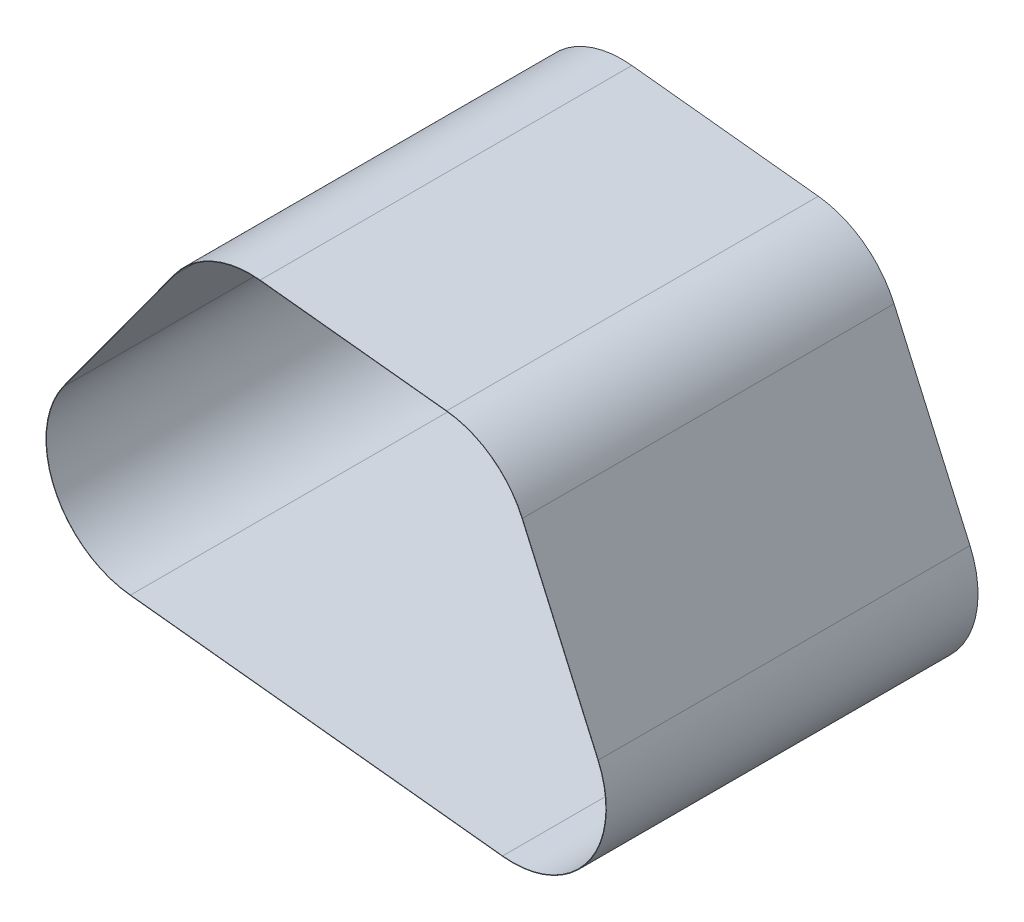
ISO-10303-21;
HEADER;
FILE_DESCRIPTION(('STEP AP214'),'2;1');
FILE_NAME('part.step','',(''),(''),'','','');
FILE_SCHEMA(('AUTOMOTIVE_DESIGN { 1 0 10303 214 1 1 1 1 }'));
ENDSEC;
DATA;
#1=APPLICATION_CONTEXT('core data for automotive mechanical design processes');
#2=APPLICATION_PROTOCOL_DEFINITION('international standard','automotive_design',2000,#1);
#3=PRODUCT_CONTEXT('',#1,'mechanical');
#4=PRODUCT('Part','Part','',(#3));
#5=PRODUCT_RELATED_PRODUCT_CATEGORY('part','',(#4));
#6=PRODUCT_DEFINITION_FORMATION('','',#4);
#7=PRODUCT_DEFINITION_CONTEXT('part definition',#1,'design');
#8=PRODUCT_DEFINITION('design','',#6,#7);
#9=PRODUCT_DEFINITION_SHAPE('','',#8);
#10=(LENGTH_UNIT() NAMED_UNIT(*) SI_UNIT(.MILLI.,.METRE.));
#11=(NAMED_UNIT(*) PLANE_ANGLE_UNIT() SI_UNIT($,.RADIAN.));
#12=(NAMED_UNIT(*) SI_UNIT($,.STERADIAN.) SOLID_ANGLE_UNIT());
#13=UNCERTAINTY_MEASURE_WITH_UNIT(LENGTH_MEASURE(1.E-05),#10,'distance_accuracy_value','');
#14=(GEOMETRIC_REPRESENTATION_CONTEXT(3) GLOBAL_UNCERTAINTY_ASSIGNED_CONTEXT((#13)) GLOBAL_UNIT_ASSIGNED_CONTEXT((#10,
#11,#12)) REPRESENTATION_CONTEXT('',''));
#15=CARTESIAN_POINT('',(0.,0.,0.));
#16=DIRECTION('',(0.,0.,1.));
#17=DIRECTION('',(1.,0.,0.));
#18=AXIS2_PLACEMENT_3D('',#15,#16,#17);
#19=CARTESIAN_POINT('',(-41.5867695911767,-37.9134735963859,-44.6));
#20=DIRECTION('',(-0.807848715200213,0.589389899259705,0.));
#21=DIRECTION('',(-0.589389899259705,-0.807848715200213,0.));
#22=AXIS2_PLACEMENT_3D('',#19,#20,#21);
#23=PLANE('',#22);
#24=DIRECTION('',(-0.589389899259705,-0.807848715200213,0.));
#25=VECTOR('',#24,1.);
#26=CARTESIAN_POINT('',(-41.5867695911767,-37.9134735963859,0.));
#27=LINE('',#26,#25);
#28=CARTESIAN_POINT('',(-9.08829804600239,6.63063636667168,0.));
#29=VERTEX_POINT('',#28);
#30=CARTESIAN_POINT('',(-22.3893322446336,-11.6004588755351,0.));
#31=VERTEX_POINT('',#30);
#32=EDGE_CURVE('E298',#29,#31,#27,.T.);
#33=ORIENTED_EDGE('',*,*,#32,.F.);
#34=DIRECTION('',(0.,0.,1.));
#35=VECTOR('',#34,1.);
#36=CARTESIAN_POINT('',(-9.08829804600239,6.63063636667168,-44.6));
#37=LINE('',#36,#35);
#38=CARTESIAN_POINT('',(-9.08829804600239,6.63063636667168,-44.6));
#39=VERTEX_POINT('',#38);
#40=EDGE_CURVE('E12',#39,#29,#37,.T.);
#41=ORIENTED_EDGE('',*,*,#40,.F.);
#42=DIRECTION('',(-0.589389899259705,-0.807848715200213,0.));
#43=VECTOR('',#42,1.);
#44=CARTESIAN_POINT('',(-41.5867695911767,-37.9134735963859,-44.6));
#45=LINE('',#44,#43);
#46=CARTESIAN_POINT('',(-22.3893322446336,-11.6004588755351,-44.6));
#47=VERTEX_POINT('',#46);
#48=EDGE_CURVE('E332',#39,#47,#45,.T.);
#49=ORIENTED_EDGE('',*,*,#48,.T.);
#50=DIRECTION('',(0.,0.,1.));
#51=VECTOR('',#50,1.);
#52=CARTESIAN_POINT('',(-22.3893322446336,-11.6004588755351,-44.6));
#53=LINE('',#52,#51);
#54=EDGE_CURVE('E132',#47,#31,#53,.T.);
#55=ORIENTED_EDGE('',*,*,#54,.T.);
#56=EDGE_LOOP('',(#33,#41,#49,#55));
#57=FACE_BOUND('',#56,.T.);
#58=ADVANCED_FACE('F129',(#57),#23,.T.);
#59=CARTESIAN_POINT('',(0.,0.,-44.6));
#60=DIRECTION('',(0.,0.,1.));
#61=DIRECTION('',(1.,0.,0.));
#62=AXIS2_PLACEMENT_3D('',#59,#60,#61);
#63=CYLINDRICAL_SURFACE('',#62,11.25);
#64=CARTESIAN_POINT('',(0.,0.,0.));
#65=DIRECTION('',(0.,0.,1.));
#66=DIRECTION('',(1.,0.,0.));
#67=AXIS2_PLACEMENT_3D('',#64,#65,#66);
#68=CIRCLE('',#67,11.25);
#69=CARTESIAN_POINT('',(1.19825107569064,11.1860043965487,0.));
#70=VERTEX_POINT('',#69);
#71=EDGE_CURVE('E329',#70,#29,#68,.T.);
#72=ORIENTED_EDGE('',*,*,#71,.F.);
#73=DIRECTION('',(0.,0.,1.));
#74=VECTOR('',#73,1.);
#75=CARTESIAN_POINT('',(1.19825107569064,11.1860043965487,-44.6));
#76=LINE('',#75,#74);
#77=CARTESIAN_POINT('',(1.19825107569064,11.1860043965487,-44.6));
#78=VERTEX_POINT('',#77);
#79=EDGE_CURVE('E137',#78,#70,#76,.T.);
#80=ORIENTED_EDGE('',*,*,#79,.F.);
#81=CARTESIAN_POINT('',(0.,0.,-44.6));
#82=DIRECTION('',(0.,0.,1.));
#83=DIRECTION('',(1.,0.,0.));
#84=AXIS2_PLACEMENT_3D('',#81,#82,#83);
#85=CIRCLE('',#84,11.25);
#86=EDGE_CURVE('E351',#78,#39,#85,.T.);
#87=ORIENTED_EDGE('',*,*,#86,.T.);
#88=ORIENTED_EDGE('',*,*,#40,.T.);
#89=EDGE_LOOP('',(#72,#80,#87,#88));
#90=FACE_BOUND('',#89,.T.);
#91=ADVANCED_FACE('F374',(#90),#63,.T.);
#92=CARTESIAN_POINT('',(18.7766325041362,9.30299830171522,-44.6));
#93=DIRECTION('',(-0.106511206728057,-0.994311501915438,0.));
#94=DIRECTION('',(0.994311501915438,-0.106511206728057,0.));
#95=AXIS2_PLACEMENT_3D('',#92,#93,#94);
#96=PLANE('',#95);
#97=DIRECTION('',(0.994311501915438,-0.106511206728057,0.));
#98=VECTOR('',#97,1.);
#99=CARTESIAN_POINT('',(18.7766325041362,9.30299830171522,0.));
#100=LINE('',#99,#98);
#101=CARTESIAN_POINT('',(23.570259868788,8.78950224516742,0.));
#102=VERTEX_POINT('',#101);
#103=EDGE_CURVE('E326',#70,#102,#100,.T.);
#104=ORIENTED_EDGE('',*,*,#103,.T.);
#105=DIRECTION('',(0.,0.,1.));
#106=VECTOR('',#105,1.);
#107=CARTESIAN_POINT('',(23.570259868788,8.78950224516742,-44.6));
#108=LINE('',#107,#106);
#109=CARTESIAN_POINT('',(23.570259868788,8.78950224516742,-44.6));
#110=VERTEX_POINT('',#109);
#111=EDGE_CURVE('E355',#110,#102,#108,.T.);
#112=ORIENTED_EDGE('',*,*,#111,.F.);
#113=DIRECTION('',(0.994311501915438,-0.106511206728057,0.));
#114=VECTOR('',#113,1.);
#115=CARTESIAN_POINT('',(18.7766325041362,9.30299830171522,-44.6));
#116=LINE('',#115,#114);
#117=EDGE_CURVE('E349',#78,#110,#116,.T.);
#118=ORIENTED_EDGE('',*,*,#117,.F.);
#119=ORIENTED_EDGE('',*,*,#79,.T.);
#120=EDGE_LOOP('',(#104,#112,#118,#119));
#121=FACE_BOUND('',#120,.T.);
#122=ADVANCED_FACE('F397',(#121),#96,.F.);
#123=CARTESIAN_POINT('',(22.3720087930974,-2.39650215138128,-44.6));
#124=DIRECTION('',(0.,0.,1.));
#125=DIRECTION('',(1.,0.,0.));
#126=AXIS2_PLACEMENT_3D('',#123,#124,#125);
#127=CYLINDRICAL_SURFACE('',#126,11.25);
#128=CARTESIAN_POINT('',(22.3720087930974,-2.39650215138128,0.));
#129=DIRECTION('',(0.,0.,1.));
#130=DIRECTION('',(1.,0.,0.));
#131=AXIS2_PLACEMENT_3D('',#128,#129,#130);
#132=CIRCLE('',#131,11.25);
#133=CARTESIAN_POINT('',(32.6584983051983,2.15878417523292,0.));
#134=VERTEX_POINT('',#133);
#135=EDGE_CURVE('E323',#134,#102,#132,.T.);
#136=ORIENTED_EDGE('',*,*,#135,.F.);
#137=DIRECTION('',(0.,0.,1.));
#138=VECTOR('',#137,1.);
#139=CARTESIAN_POINT('',(32.6584983051983,2.15878417523292,-44.6));
#140=LINE('',#139,#138);
#141=CARTESIAN_POINT('',(32.6584983051983,2.15878417523292,-44.6));
#142=VERTEX_POINT('',#141);
#143=EDGE_CURVE('E357',#142,#134,#140,.T.);
#144=ORIENTED_EDGE('',*,*,#143,.F.);
#145=CARTESIAN_POINT('',(22.3720087930974,-2.39650215138128,-44.6));
#146=DIRECTION('',(0.,0.,1.));
#147=DIRECTION('',(1.,0.,0.));
#148=AXIS2_PLACEMENT_3D('',#145,#146,#147);
#149=CIRCLE('',#148,11.25);
#150=EDGE_CURVE('E346',#142,#110,#149,.T.);
#151=ORIENTED_EDGE('',*,*,#150,.T.);
#152=ORIENTED_EDGE('',*,*,#111,.T.);
#153=EDGE_LOOP('',(#136,#144,#151,#152));
#154=FACE_BOUND('',#153,.T.);
#155=ADVANCED_FACE('F394',(#154),#127,.T.);
#156=CARTESIAN_POINT('',(57.5881231878783,-54.1358823966706,-44.6));
#157=DIRECTION('',(-0.914354623297857,-0.404914340143485,0.));
#158=DIRECTION('',(0.404914340143485,-0.914354623297857,0.));
#159=AXIS2_PLACEMENT_3D('',#156,#157,#158);
#160=PLANE('',#159);
#161=DIRECTION('',(0.404914340143485,-0.914354623297857,0.));
#162=VECTOR('',#161,1.);
#163=CARTESIAN_POINT('',(57.5881231878783,-54.1358823966706,0.));
#164=LINE('',#163,#162);
#165=CARTESIAN_POINT('',(41.7690709584267,-18.4141948489689,0.));
#166=VERTEX_POINT('',#165);
#167=EDGE_CURVE('E320',#134,#166,#164,.T.);
#168=ORIENTED_EDGE('',*,*,#167,.T.);
#169=DIRECTION('',(0.,0.,1.));
#170=VECTOR('',#169,1.);
#171=CARTESIAN_POINT('',(41.7690709584267,-18.4141948489689,-44.6));
#172=LINE('',#171,#170);
#173=CARTESIAN_POINT('',(41.7690709584267,-18.4141948489689,-44.6));
#174=VERTEX_POINT('',#173);
#175=EDGE_CURVE('E359',#174,#166,#172,.T.);
#176=ORIENTED_EDGE('',*,*,#175,.F.);
#177=DIRECTION('',(0.404914340143485,-0.914354623297857,0.));
#178=VECTOR('',#177,1.);
#179=CARTESIAN_POINT('',(57.5881231878783,-54.1358823966706,-44.6));
#180=LINE('',#179,#178);
#181=EDGE_CURVE('E344',#142,#174,#180,.T.);
#182=ORIENTED_EDGE('',*,*,#181,.F.);
#183=ORIENTED_EDGE('',*,*,#143,.T.);
#184=EDGE_LOOP('',(#168,#176,#182,#183));
#185=FACE_BOUND('',#184,.T.);
#186=ADVANCED_FACE('F391',(#185),#160,.F.);
#187=CARTESIAN_POINT('',(31.4825814463258,-22.9694811755831,-44.6));
#188=DIRECTION('',(0.,0.,1.));
#189=DIRECTION('',(1.,0.,0.));
#190=AXIS2_PLACEMENT_3D('',#187,#188,#189);
#191=CYLINDRICAL_SURFACE('',#190,11.25);
#192=CARTESIAN_POINT('',(31.4825814463258,-22.9694811755831,0.));
#193=DIRECTION('',(0.,0.,1.));
#194=DIRECTION('',(1.,0.,0.));
#195=AXIS2_PLACEMENT_3D('',#192,#193,#194);
#196=CIRCLE('',#195,11.25);
#197=CARTESIAN_POINT('',(30.284236401296,-34.1554755056841,0.));
#198=VERTEX_POINT('',#197);
#199=EDGE_CURVE('E317',#198,#166,#196,.T.);
#200=ORIENTED_EDGE('',*,*,#199,.F.);
#201=DIRECTION('',(0.,0.,1.));
#202=VECTOR('',#201,1.);
#203=CARTESIAN_POINT('',(30.284236401296,-34.1554755056841,-44.6));
#204=LINE('',#203,#202);
#205=CARTESIAN_POINT('',(30.284236401296,-34.1554755056841,-44.6));
#206=VERTEX_POINT('',#205);
#207=EDGE_CURVE('E361',#206,#198,#204,.T.);
#208=ORIENTED_EDGE('',*,*,#207,.F.);
#209=CARTESIAN_POINT('',(31.4825814463258,-22.9694811755831,-44.6));
#210=DIRECTION('',(0.,0.,1.));
#211=DIRECTION('',(1.,0.,0.));
#212=AXIS2_PLACEMENT_3D('',#209,#210,#211);
#213=CIRCLE('',#212,11.25);
#214=EDGE_CURVE('E341',#206,#174,#213,.T.);
#215=ORIENTED_EDGE('',*,*,#214,.T.);
#216=ORIENTED_EDGE('',*,*,#175,.T.);
#217=EDGE_LOOP('',(#200,#208,#215,#216));
#218=FACE_BOUND('',#217,.T.);
#219=ADVANCED_FACE('F387',(#218),#191,.T.);
#220=CARTESIAN_POINT('',(14.3050733317243,-32.4436428046237,-44.6));
#221=DIRECTION('',(-0.106519559558202,-0.994310607120092,0.));
#222=DIRECTION('',(0.994310607120092,-0.106519559558202,0.));
#223=AXIS2_PLACEMENT_3D('',#220,#221,#222);
#224=PLANE('',#223);
#225=DIRECTION('',(0.994310607120092,-0.106519559558202,0.));
#226=VECTOR('',#225,1.);
#227=CARTESIAN_POINT('',(14.3050733317243,-32.4436428046237,0.));
#228=LINE('',#227,#226);
#229=CARTESIAN_POINT('',(-14.3680404328542,-29.3719191123547,0.));
#230=VERTEX_POINT('',#229);
#231=EDGE_CURVE('E314',#230,#198,#228,.T.);
#232=ORIENTED_EDGE('',*,*,#231,.F.);
#233=DIRECTION('',(0.,0.,1.));
#234=VECTOR('',#233,1.);
#235=CARTESIAN_POINT('',(-14.3680404328542,-29.3719191123547,-44.6));
#236=LINE('',#235,#234);
#237=CARTESIAN_POINT('',(-14.3680404328542,-29.3719191123547,-44.6));
#238=VERTEX_POINT('',#237);
#239=EDGE_CURVE('E362',#238,#230,#236,.T.);
#240=ORIENTED_EDGE('',*,*,#239,.F.);
#241=DIRECTION('',(0.994310607120092,-0.106519559558202,0.));
#242=VECTOR('',#241,1.);
#243=CARTESIAN_POINT('',(14.3050733317243,-32.4436428046237,-44.6));
#244=LINE('',#243,#242);
#245=EDGE_CURVE('E338',#238,#206,#244,.T.);
#246=ORIENTED_EDGE('',*,*,#245,.T.);
#247=ORIENTED_EDGE('',*,*,#207,.T.);
#248=EDGE_LOOP('',(#232,#240,#246,#247));
#249=FACE_BOUND('',#248,.T.);
#250=ADVANCED_FACE('F382',(#249),#224,.T.);
#251=CARTESIAN_POINT('',(-13.2614361398689,-18.1764768728205,-44.6));
#252=DIRECTION('',(0.,0.,1.));
#253=DIRECTION('',(1.,0.,0.));
#254=AXIS2_PLACEMENT_3D('',#251,#252,#253);
#255=CYLINDRICAL_SURFACE('',#254,11.25);
#256=CARTESIAN_POINT('',(-13.2614361398689,-18.1764768728205,0.));
#257=DIRECTION('',(0.,0.,1.));
#258=DIRECTION('',(1.,0.,0.));
#259=AXIS2_PLACEMENT_3D('',#256,#257,#258);
#260=CIRCLE('',#259,11.25);
#261=EDGE_CURVE('E311',#31,#230,#260,.T.);
#262=ORIENTED_EDGE('',*,*,#261,.F.);
#263=ORIENTED_EDGE('',*,*,#54,.F.);
#264=CARTESIAN_POINT('',(-13.2614361398689,-18.1764768728205,-44.6));
#265=DIRECTION('',(0.,0.,1.));
#266=DIRECTION('',(1.,0.,0.));
#267=AXIS2_PLACEMENT_3D('',#264,#265,#266);
#268=CIRCLE('',#267,11.25);
#269=EDGE_CURVE('E335',#47,#238,#268,.T.);
#270=ORIENTED_EDGE('',*,*,#269,.T.);
#271=ORIENTED_EDGE('',*,*,#239,.T.);
#272=EDGE_LOOP('',(#262,#263,#270,#271));
#273=FACE_BOUND('',#272,.T.);
#274=ADVANCED_FACE('F370',(#273),#255,.T.);
#275=CARTESIAN_POINT('',(-13.2614361398689,-18.1764768728205,-44.6));
#276=DIRECTION('',(0.,0.,1.));
#277=DIRECTION('',(1.,0.,0.));
#278=AXIS2_PLACEMENT_3D('',#275,#276,#277);
#279=PLANE('',#278);
#280=CARTESIAN_POINT('',(0.,0.,-44.6));
#281=DIRECTION('',(0.,0.,1.));
#282=DIRECTION('',(1.,0.,0.));
#283=AXIS2_PLACEMENT_3D('',#280,#281,#282);
#284=CIRCLE('',#283,11.2);
#285=CARTESIAN_POINT('',(1.19292551535423,11.1362888214529,-44.6));
#286=VERTEX_POINT('',#285);
#287=CARTESIAN_POINT('',(-9.04790561024238,6.6011668717087,-44.6));
#288=VERTEX_POINT('',#287);
#289=EDGE_CURVE('E293',#286,#288,#284,.T.);
#290=ORIENTED_EDGE('',*,*,#289,.T.);
#291=DIRECTION('',(-0.589389899259705,-0.807848715200213,0.));
#292=VECTOR('',#291,1.);
#293=CARTESIAN_POINT('',(-41.5463771554167,-37.9429430913489,-44.6));
#294=LINE('',#293,#292);
#295=CARTESIAN_POINT('',(-22.3488513508705,-11.6298071253185,-44.6));
#296=VERTEX_POINT('',#295);
#297=EDGE_CURVE('E277',#288,#296,#294,.T.);
#298=ORIENTED_EDGE('',*,*,#297,.T.);
#299=CARTESIAN_POINT('',(-13.2614361398689,-18.1764768728205,-44.6));
#300=DIRECTION('',(0.,0.,1.));
#301=DIRECTION('',(1.,0.,0.));
#302=AXIS2_PLACEMENT_3D('',#299,#300,#301);
#303=CIRCLE('',#302,11.2);
#304=CARTESIAN_POINT('',(-14.3629184640877,-29.3221817266839,-44.6));
#305=VERTEX_POINT('',#304);
#306=EDGE_CURVE('E280',#296,#305,#303,.T.);
#307=ORIENTED_EDGE('',*,*,#306,.T.);
#308=DIRECTION('',(0.994310607120092,-0.106519559558202,0.));
#309=VECTOR('',#308,1.);
#310=CARTESIAN_POINT('',(14.3103993097022,-32.3939272742676,-44.6));
#311=LINE('',#310,#309);
#312=CARTESIAN_POINT('',(30.2895623792739,-34.1057599753281,-44.6));
#313=VERTEX_POINT('',#312);
#314=EDGE_CURVE('E145',#305,#313,#311,.T.);
#315=ORIENTED_EDGE('',*,*,#314,.T.);
#316=CARTESIAN_POINT('',(31.4825814463258,-22.9694811755831,-44.6));
#317=DIRECTION('',(0.,0.,1.));
#318=DIRECTION('',(1.,0.,0.));
#319=AXIS2_PLACEMENT_3D('',#316,#317,#318);
#320=CIRCLE('',#319,11.2);
#321=CARTESIAN_POINT('',(41.7233532272618,-18.434440565976,-44.6));
#322=VERTEX_POINT('',#321);
#323=EDGE_CURVE('E283',#313,#322,#320,.T.);
#324=ORIENTED_EDGE('',*,*,#323,.T.);
#325=DIRECTION('',(0.404914340143485,-0.914354623297857,0.));
#326=VECTOR('',#325,1.);
#327=CARTESIAN_POINT('',(57.5424054567134,-54.1561281136777,-44.6));
#328=LINE('',#327,#326);
#329=CARTESIAN_POINT('',(32.6127805740334,2.13853845822575,-44.6));
#330=VERTEX_POINT('',#329);
#331=EDGE_CURVE('E286',#330,#322,#328,.T.);
#332=ORIENTED_EDGE('',*,*,#331,.F.);
#333=CARTESIAN_POINT('',(22.3720087930974,-2.39650215138128,-44.6));
#334=DIRECTION('',(0.,0.,1.));
#335=DIRECTION('',(1.,0.,0.));
#336=AXIS2_PLACEMENT_3D('',#333,#334,#335);
#337=CIRCLE('',#336,11.2);
#338=CARTESIAN_POINT('',(23.5649343084516,8.73978667007164,-44.6));
#339=VERTEX_POINT('',#338);
#340=EDGE_CURVE('E288',#330,#339,#337,.T.);
#341=ORIENTED_EDGE('',*,*,#340,.T.);
#342=DIRECTION('',(0.994311501915438,-0.106511206728057,0.));
#343=VECTOR('',#342,1.);
#344=CARTESIAN_POINT('',(18.7713069437998,9.25328272661944,-44.6));
#345=LINE('',#344,#343);
#346=EDGE_CURVE('E291',#286,#339,#345,.T.);
#347=ORIENTED_EDGE('',*,*,#346,.F.);
#348=EDGE_LOOP('',(#290,#298,#307,#315,#324,#332,#341,#347));
#349=FACE_BOUND('',#348,.T.);
#350=ORIENTED_EDGE('',*,*,#48,.F.);
#351=ORIENTED_EDGE('',*,*,#86,.F.);
#352=ORIENTED_EDGE('',*,*,#117,.T.);
#353=ORIENTED_EDGE('',*,*,#150,.F.);
#354=ORIENTED_EDGE('',*,*,#181,.T.);
#355=ORIENTED_EDGE('',*,*,#214,.F.);
#356=ORIENTED_EDGE('',*,*,#245,.F.);
#357=ORIENTED_EDGE('',*,*,#269,.F.);
#358=EDGE_LOOP('',(#350,#351,#352,#353,#354,#355,#356,#357));
#359=FACE_BOUND('',#358,.T.);
#360=ADVANCED_FACE('F378',(#349,#359),#279,.F.);
#361=CARTESIAN_POINT('',(-13.2614361398689,-18.1764768728205,0.));
#362=DIRECTION('',(0.,0.,1.));
#363=DIRECTION('',(1.,0.,0.));
#364=AXIS2_PLACEMENT_3D('',#361,#362,#363);
#365=PLANE('',#364);
#366=DIRECTION('',(-0.589389899259705,-0.807848715200213,0.));
#367=VECTOR('',#366,1.);
#368=CARTESIAN_POINT('',(-41.5463771554167,-37.9429430913489,0.));
#369=LINE('',#368,#367);
#370=CARTESIAN_POINT('',(-9.04790561024238,6.6011668717087,0.));
#371=VERTEX_POINT('',#370);
#372=CARTESIAN_POINT('',(-22.3488513508705,-11.6298071253185,0.));
#373=VERTEX_POINT('',#372);
#374=EDGE_CURVE('E153',#371,#373,#369,.T.);
#375=ORIENTED_EDGE('',*,*,#374,.F.);
#376=CARTESIAN_POINT('',(0.,0.,0.));
#377=DIRECTION('',(0.,0.,1.));
#378=DIRECTION('',(1.,0.,0.));
#379=AXIS2_PLACEMENT_3D('',#376,#377,#378);
#380=CIRCLE('',#379,11.2);
#381=CARTESIAN_POINT('',(1.19292551535423,11.1362888214529,0.));
#382=VERTEX_POINT('',#381);
#383=EDGE_CURVE('E274',#382,#371,#380,.T.);
#384=ORIENTED_EDGE('',*,*,#383,.F.);
#385=DIRECTION('',(0.994311501915438,-0.106511206728057,0.));
#386=VECTOR('',#385,1.);
#387=CARTESIAN_POINT('',(18.7713069437998,9.25328272661944,0.));
#388=LINE('',#387,#386);
#389=CARTESIAN_POINT('',(23.5649343084516,8.73978667007164,0.));
#390=VERTEX_POINT('',#389);
#391=EDGE_CURVE('E271',#382,#390,#388,.T.);
#392=ORIENTED_EDGE('',*,*,#391,.T.);
#393=CARTESIAN_POINT('',(22.3720087930974,-2.39650215138128,0.));
#394=DIRECTION('',(0.,0.,1.));
#395=DIRECTION('',(1.,0.,0.));
#396=AXIS2_PLACEMENT_3D('',#393,#394,#395);
#397=CIRCLE('',#396,11.2);
#398=CARTESIAN_POINT('',(32.6127805740334,2.13853845822575,0.));
#399=VERTEX_POINT('',#398);
#400=EDGE_CURVE('E268',#399,#390,#397,.T.);
#401=ORIENTED_EDGE('',*,*,#400,.F.);
#402=DIRECTION('',(0.404914340143485,-0.914354623297857,0.));
#403=VECTOR('',#402,1.);
#404=CARTESIAN_POINT('',(57.5424054567134,-54.1561281136777,0.));
#405=LINE('',#404,#403);
#406=CARTESIAN_POINT('',(41.7233532272618,-18.434440565976,0.));
#407=VERTEX_POINT('',#406);
#408=EDGE_CURVE('E263',#399,#407,#405,.T.);
#409=ORIENTED_EDGE('',*,*,#408,.T.);
#410=CARTESIAN_POINT('',(31.4825814463258,-22.9694811755831,0.));
#411=DIRECTION('',(0.,0.,1.));
#412=DIRECTION('',(1.,0.,0.));
#413=AXIS2_PLACEMENT_3D('',#410,#411,#412);
#414=CIRCLE('',#413,11.2);
#415=CARTESIAN_POINT('',(30.2895623792739,-34.1057599753281,0.));
#416=VERTEX_POINT('',#415);
#417=EDGE_CURVE('E261',#416,#407,#414,.T.);
#418=ORIENTED_EDGE('',*,*,#417,.F.);
#419=DIRECTION('',(0.994310607120092,-0.106519559558202,0.));
#420=VECTOR('',#419,1.);
#421=CARTESIAN_POINT('',(14.3103993097022,-32.3939272742676,0.));
#422=LINE('',#421,#420);
#423=CARTESIAN_POINT('',(-14.3629184640877,-29.3221817266839,0.));
#424=VERTEX_POINT('',#423);
#425=EDGE_CURVE('E244',#424,#416,#422,.T.);
#426=ORIENTED_EDGE('',*,*,#425,.F.);
#427=CARTESIAN_POINT('',(-13.2614361398689,-18.1764768728205,0.));
#428=DIRECTION('',(0.,0.,1.));
#429=DIRECTION('',(1.,0.,0.));
#430=AXIS2_PLACEMENT_3D('',#427,#428,#429);
#431=CIRCLE('',#430,11.2);
#432=EDGE_CURVE('E253',#373,#424,#431,.T.);
#433=ORIENTED_EDGE('',*,*,#432,.F.);
#434=EDGE_LOOP('',(#375,#384,#392,#401,#409,#418,#426,#433));
#435=FACE_BOUND('',#434,.T.);
#436=ORIENTED_EDGE('',*,*,#32,.T.);
#437=ORIENTED_EDGE('',*,*,#261,.T.);
#438=ORIENTED_EDGE('',*,*,#231,.T.);
#439=ORIENTED_EDGE('',*,*,#199,.T.);
#440=ORIENTED_EDGE('',*,*,#167,.F.);
#441=ORIENTED_EDGE('',*,*,#135,.T.);
#442=ORIENTED_EDGE('',*,*,#103,.F.);
#443=ORIENTED_EDGE('',*,*,#71,.T.);
#444=EDGE_LOOP('',(#436,#437,#438,#439,#440,#441,#442,#443));
#445=FACE_BOUND('',#444,.T.);
#446=ADVANCED_FACE('F257',(#435,#445),#365,.T.);
#447=CARTESIAN_POINT('',(-41.5463771554167,-37.9429430913489,-44.6));
#448=DIRECTION('',(-0.807848715200213,0.589389899259705,0.));
#449=DIRECTION('',(-0.589389899259705,-0.807848715200213,0.));
#450=AXIS2_PLACEMENT_3D('',#447,#448,#449);
#451=PLANE('',#450);
#452=ORIENTED_EDGE('',*,*,#374,.T.);
#453=DIRECTION('',(0.,0.,1.));
#454=VECTOR('',#453,1.);
#455=CARTESIAN_POINT('',(-22.3488513508705,-11.6298071253185,-44.6));
#456=LINE('',#455,#454);
#457=EDGE_CURVE('E250',#296,#373,#456,.T.);
#458=ORIENTED_EDGE('',*,*,#457,.F.);
#459=ORIENTED_EDGE('',*,*,#297,.F.);
#460=DIRECTION('',(0.,0.,1.));
#461=VECTOR('',#460,1.);
#462=CARTESIAN_POINT('',(-9.04790561024238,6.6011668717087,-44.6));
#463=LINE('',#462,#461);
#464=EDGE_CURVE('E296',#288,#371,#463,.T.);
#465=ORIENTED_EDGE('',*,*,#464,.T.);
#466=EDGE_LOOP('',(#452,#458,#459,#465));
#467=FACE_BOUND('',#466,.T.);
#468=ADVANCED_FACE('F472',(#467),#451,.F.);
#469=CARTESIAN_POINT('',(0.,0.,-44.6));
#470=DIRECTION('',(0.,0.,1.));
#471=DIRECTION('',(1.,0.,0.));
#472=AXIS2_PLACEMENT_3D('',#469,#470,#471);
#473=CYLINDRICAL_SURFACE('',#472,11.2);
#474=ORIENTED_EDGE('',*,*,#383,.T.);
#475=ORIENTED_EDGE('',*,*,#464,.F.);
#476=ORIENTED_EDGE('',*,*,#289,.F.);
#477=DIRECTION('',(0.,0.,1.));
#478=VECTOR('',#477,1.);
#479=CARTESIAN_POINT('',(1.19292551535423,11.1362888214529,-44.6));
#480=LINE('',#479,#478);
#481=EDGE_CURVE('E299',#286,#382,#480,.T.);
#482=ORIENTED_EDGE('',*,*,#481,.T.);
#483=EDGE_LOOP('',(#474,#475,#476,#482));
#484=FACE_BOUND('',#483,.T.);
#485=ADVANCED_FACE('F481',(#484),#473,.F.);
#486=CARTESIAN_POINT('',(18.7713069437998,9.25328272661944,-44.6));
#487=DIRECTION('',(-0.106511206728057,-0.994311501915438,0.));
#488=DIRECTION('',(0.994311501915438,-0.106511206728057,0.));
#489=AXIS2_PLACEMENT_3D('',#486,#487,#488);
#490=PLANE('',#489);
#491=ORIENTED_EDGE('',*,*,#391,.F.);
#492=ORIENTED_EDGE('',*,*,#481,.F.);
#493=ORIENTED_EDGE('',*,*,#346,.T.);
#494=DIRECTION('',(0.,0.,1.));
#495=VECTOR('',#494,1.);
#496=CARTESIAN_POINT('',(23.5649343084516,8.73978667007164,-44.6));
#497=LINE('',#496,#495);
#498=EDGE_CURVE('E301',#339,#390,#497,.T.);
#499=ORIENTED_EDGE('',*,*,#498,.T.);
#500=EDGE_LOOP('',(#491,#492,#493,#499));
#501=FACE_BOUND('',#500,.T.);
#502=ADVANCED_FACE('F490',(#501),#490,.T.);
#503=CARTESIAN_POINT('',(22.3720087930974,-2.39650215138128,-44.6));
#504=DIRECTION('',(0.,0.,1.));
#505=DIRECTION('',(1.,0.,0.));
#506=AXIS2_PLACEMENT_3D('',#503,#504,#505);
#507=CYLINDRICAL_SURFACE('',#506,11.2);
#508=ORIENTED_EDGE('',*,*,#400,.T.);
#509=ORIENTED_EDGE('',*,*,#498,.F.);
#510=ORIENTED_EDGE('',*,*,#340,.F.);
#511=DIRECTION('',(0.,0.,1.));
#512=VECTOR('',#511,1.);
#513=CARTESIAN_POINT('',(32.6127805740334,2.13853845822575,-44.6));
#514=LINE('',#513,#512);
#515=EDGE_CURVE('E303',#330,#399,#514,.T.);
#516=ORIENTED_EDGE('',*,*,#515,.T.);
#517=EDGE_LOOP('',(#508,#509,#510,#516));
#518=FACE_BOUND('',#517,.T.);
#519=ADVANCED_FACE('F500',(#518),#507,.F.);
#520=CARTESIAN_POINT('',(57.5424054567134,-54.1561281136777,-44.6));
#521=DIRECTION('',(-0.914354623297857,-0.404914340143485,0.));
#522=DIRECTION('',(0.404914340143485,-0.914354623297857,0.));
#523=AXIS2_PLACEMENT_3D('',#520,#521,#522);
#524=PLANE('',#523);
#525=ORIENTED_EDGE('',*,*,#408,.F.);
#526=ORIENTED_EDGE('',*,*,#515,.F.);
#527=ORIENTED_EDGE('',*,*,#331,.T.);
#528=DIRECTION('',(0.,0.,1.));
#529=VECTOR('',#528,1.);
#530=CARTESIAN_POINT('',(41.7233532272618,-18.434440565976,-44.6));
#531=LINE('',#530,#529);
#532=EDGE_CURVE('E305',#322,#407,#531,.T.);
#533=ORIENTED_EDGE('',*,*,#532,.T.);
#534=EDGE_LOOP('',(#525,#526,#527,#533));
#535=FACE_BOUND('',#534,.T.);
#536=ADVANCED_FACE('F510',(#535),#524,.T.);
#537=CARTESIAN_POINT('',(31.4825814463258,-22.9694811755831,-44.6));
#538=DIRECTION('',(0.,0.,1.));
#539=DIRECTION('',(1.,0.,0.));
#540=AXIS2_PLACEMENT_3D('',#537,#538,#539);
#541=CYLINDRICAL_SURFACE('',#540,11.2);
#542=ORIENTED_EDGE('',*,*,#417,.T.);
#543=ORIENTED_EDGE('',*,*,#532,.F.);
#544=ORIENTED_EDGE('',*,*,#323,.F.);
#545=DIRECTION('',(0.,0.,1.));
#546=VECTOR('',#545,1.);
#547=CARTESIAN_POINT('',(30.2895623792739,-34.1057599753281,-44.6));
#548=LINE('',#547,#546);
#549=EDGE_CURVE('E249',#313,#416,#548,.T.);
#550=ORIENTED_EDGE('',*,*,#549,.T.);
#551=EDGE_LOOP('',(#542,#543,#544,#550));
#552=FACE_BOUND('',#551,.T.);
#553=ADVANCED_FACE('F520',(#552),#541,.F.);
#554=CARTESIAN_POINT('',(14.3103993097022,-32.3939272742676,-44.6));
#555=DIRECTION('',(-0.106519559558202,-0.994310607120092,0.));
#556=DIRECTION('',(0.994310607120092,-0.106519559558202,0.));
#557=AXIS2_PLACEMENT_3D('',#554,#555,#556);
#558=PLANE('',#557);
#559=ORIENTED_EDGE('',*,*,#425,.T.);
#560=ORIENTED_EDGE('',*,*,#549,.F.);
#561=ORIENTED_EDGE('',*,*,#314,.F.);
#562=DIRECTION('',(0.,0.,1.));
#563=VECTOR('',#562,1.);
#564=CARTESIAN_POINT('',(-14.3629184640877,-29.3221817266839,-44.6));
#565=LINE('',#564,#563);
#566=EDGE_CURVE('E240',#305,#424,#565,.T.);
#567=ORIENTED_EDGE('',*,*,#566,.T.);
#568=EDGE_LOOP('',(#559,#560,#561,#567));
#569=FACE_BOUND('',#568,.T.);
#570=ADVANCED_FACE('F242',(#569),#558,.F.);
#571=CARTESIAN_POINT('',(-13.2614361398689,-18.1764768728205,-44.6));
#572=DIRECTION('',(0.,0.,1.));
#573=DIRECTION('',(1.,0.,0.));
#574=AXIS2_PLACEMENT_3D('',#571,#572,#573);
#575=CYLINDRICAL_SURFACE('',#574,11.2);
#576=ORIENTED_EDGE('',*,*,#432,.T.);
#577=ORIENTED_EDGE('',*,*,#566,.F.);
#578=ORIENTED_EDGE('',*,*,#306,.F.);
#579=ORIENTED_EDGE('',*,*,#457,.T.);
#580=EDGE_LOOP('',(#576,#577,#578,#579));
#581=FACE_BOUND('',#580,.T.);
#582=ADVANCED_FACE('F254',(#581),#575,.F.);
#583=CLOSED_SHELL('',(#58,#91,#122,#155,#186,#219,#250,#274,#360,#446,#468,#485,#502,#519,#536,
#553,#570,#582));
#584=MANIFOLD_SOLID_BREP('B2',#583);
#585=ADVANCED_BREP_SHAPE_REPRESENTATION('',(#18,#584),#14);
#586=SHAPE_DEFINITION_REPRESENTATION(#9,#585);
ENDSEC;
END-ISO-10303-21;
